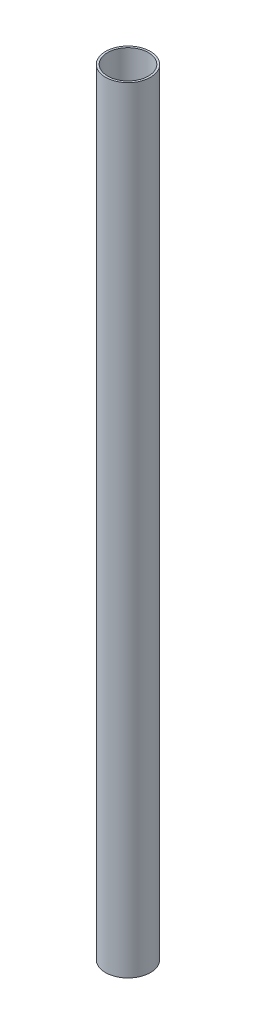
ISO-10303-21;
HEADER;
FILE_DESCRIPTION(('STEP AP214'),'2;1');
FILE_NAME('part.step','',(''),(''),'','','');
FILE_SCHEMA(('AUTOMOTIVE_DESIGN { 1 0 10303 214 1 1 1 1 }'));
ENDSEC;
DATA;
#1=APPLICATION_CONTEXT('core data for automotive mechanical design processes');
#2=APPLICATION_PROTOCOL_DEFINITION('international standard','automotive_design',2000,#1);
#3=PRODUCT_CONTEXT('',#1,'mechanical');
#4=PRODUCT('Part','Part','',(#3));
#5=PRODUCT_RELATED_PRODUCT_CATEGORY('part','',(#4));
#6=PRODUCT_DEFINITION_FORMATION('','',#4);
#7=PRODUCT_DEFINITION_CONTEXT('part definition',#1,'design');
#8=PRODUCT_DEFINITION('design','',#6,#7);
#9=PRODUCT_DEFINITION_SHAPE('','',#8);
#10=(LENGTH_UNIT() NAMED_UNIT(*) SI_UNIT(.MILLI.,.METRE.));
#11=(NAMED_UNIT(*) PLANE_ANGLE_UNIT() SI_UNIT($,.RADIAN.));
#12=(NAMED_UNIT(*) SI_UNIT($,.STERADIAN.) SOLID_ANGLE_UNIT());
#13=UNCERTAINTY_MEASURE_WITH_UNIT(LENGTH_MEASURE(1.E-05),#10,'distance_accuracy_value','');
#14=(GEOMETRIC_REPRESENTATION_CONTEXT(3) GLOBAL_UNCERTAINTY_ASSIGNED_CONTEXT((#13)) GLOBAL_UNIT_ASSIGNED_CONTEXT((#10,
#11,#12)) REPRESENTATION_CONTEXT('',''));
#15=CARTESIAN_POINT('',(0.,0.,0.));
#16=DIRECTION('',(0.,0.,1.));
#17=DIRECTION('',(1.,0.,0.));
#18=AXIS2_PLACEMENT_3D('',#15,#16,#17);
#19=CARTESIAN_POINT('',(0.,0.,0.));
#20=DIRECTION('',(0.,-1.,0.));
#21=DIRECTION('',(0.,0.,-1.));
#22=AXIS2_PLACEMENT_3D('',#19,#20,#21);
#23=CYLINDRICAL_SURFACE('',#22,27.94);
#24=CARTESIAN_POINT('',(0.,-965.2,0.));
#25=DIRECTION('',(0.,1.,0.));
#26=DIRECTION('',(0.,0.,1.));
#27=AXIS2_PLACEMENT_3D('',#24,#25,#26);
#28=CIRCLE('',#27,27.94);
#29=CARTESIAN_POINT('',(0.,-965.2,27.94));
#30=VERTEX_POINT('',#29);
#31=EDGE_CURVE('E43',#30,#30,#28,.T.);
#32=ORIENTED_EDGE('',*,*,#31,.T.);
#33=EDGE_LOOP('',(#32));
#34=FACE_BOUND('',#33,.T.);
#35=CARTESIAN_POINT('',(0.,0.,0.));
#36=DIRECTION('',(0.,1.,0.));
#37=DIRECTION('',(0.,0.,1.));
#38=AXIS2_PLACEMENT_3D('',#35,#36,#37);
#39=CIRCLE('',#38,27.94);
#40=CARTESIAN_POINT('',(0.,0.,27.94));
#41=VERTEX_POINT('',#40);
#42=EDGE_CURVE('E34',#41,#41,#39,.T.);
#43=ORIENTED_EDGE('',*,*,#42,.F.);
#44=EDGE_LOOP('',(#43));
#45=FACE_BOUND('',#44,.T.);
#46=ADVANCED_FACE('F31',(#34,#45),#23,.T.);
#47=CARTESIAN_POINT('',(0.,0.,0.));
#48=DIRECTION('',(0.,1.,0.));
#49=DIRECTION('',(0.,0.,1.));
#50=AXIS2_PLACEMENT_3D('',#47,#48,#49);
#51=PLANE('',#50);
#52=CARTESIAN_POINT('',(0.,0.,0.));
#53=DIRECTION('',(0.,1.,0.));
#54=DIRECTION('',(0.,0.,1.));
#55=AXIS2_PLACEMENT_3D('',#52,#53,#54);
#56=CIRCLE('',#55,25.4);
#57=CARTESIAN_POINT('',(0.,0.,25.4));
#58=VERTEX_POINT('',#57);
#59=EDGE_CURVE('E38',#58,#58,#56,.F.);
#60=ORIENTED_EDGE('',*,*,#59,.T.);
#61=EDGE_LOOP('',(#60));
#62=FACE_BOUND('',#61,.T.);
#63=ORIENTED_EDGE('',*,*,#42,.T.);
#64=EDGE_LOOP('',(#63));
#65=FACE_BOUND('',#64,.T.);
#66=ADVANCED_FACE('F51',(#62,#65),#51,.T.);
#67=CARTESIAN_POINT('',(0.,-965.2,0.));
#68=DIRECTION('',(0.,1.,0.));
#69=DIRECTION('',(0.,0.,1.));
#70=AXIS2_PLACEMENT_3D('',#67,#68,#69);
#71=PLANE('',#70);
#72=CARTESIAN_POINT('',(0.,-965.2,0.));
#73=DIRECTION('',(0.,1.,0.));
#74=DIRECTION('',(0.,0.,1.));
#75=AXIS2_PLACEMENT_3D('',#72,#73,#74);
#76=CIRCLE('',#75,25.4);
#77=CARTESIAN_POINT('',(0.,-965.2,25.4));
#78=VERTEX_POINT('',#77);
#79=EDGE_CURVE('E10',#78,#78,#76,.F.);
#80=ORIENTED_EDGE('',*,*,#79,.F.);
#81=EDGE_LOOP('',(#80));
#82=FACE_BOUND('',#81,.T.);
#83=ORIENTED_EDGE('',*,*,#31,.F.);
#84=EDGE_LOOP('',(#83));
#85=FACE_BOUND('',#84,.T.);
#86=ADVANCED_FACE('F57',(#82,#85),#71,.F.);
#87=CARTESIAN_POINT('',(0.,0.,0.));
#88=DIRECTION('',(0.,-1.,0.));
#89=DIRECTION('',(0.,0.,-1.));
#90=AXIS2_PLACEMENT_3D('',#87,#88,#89);
#91=CYLINDRICAL_SURFACE('',#90,25.4);
#92=ORIENTED_EDGE('',*,*,#79,.T.);
#93=EDGE_LOOP('',(#92));
#94=FACE_BOUND('',#93,.T.);
#95=ORIENTED_EDGE('',*,*,#59,.F.);
#96=EDGE_LOOP('',(#95));
#97=FACE_BOUND('',#96,.T.);
#98=ADVANCED_FACE('F59',(#94,#97),#91,.F.);
#99=CLOSED_SHELL('',(#46,#66,#86,#98));
#100=MANIFOLD_SOLID_BREP('B2',#99);
#101=ADVANCED_BREP_SHAPE_REPRESENTATION('',(#18,#100),#14);
#102=SHAPE_DEFINITION_REPRESENTATION(#9,#101);
ENDSEC;
END-ISO-10303-21;
